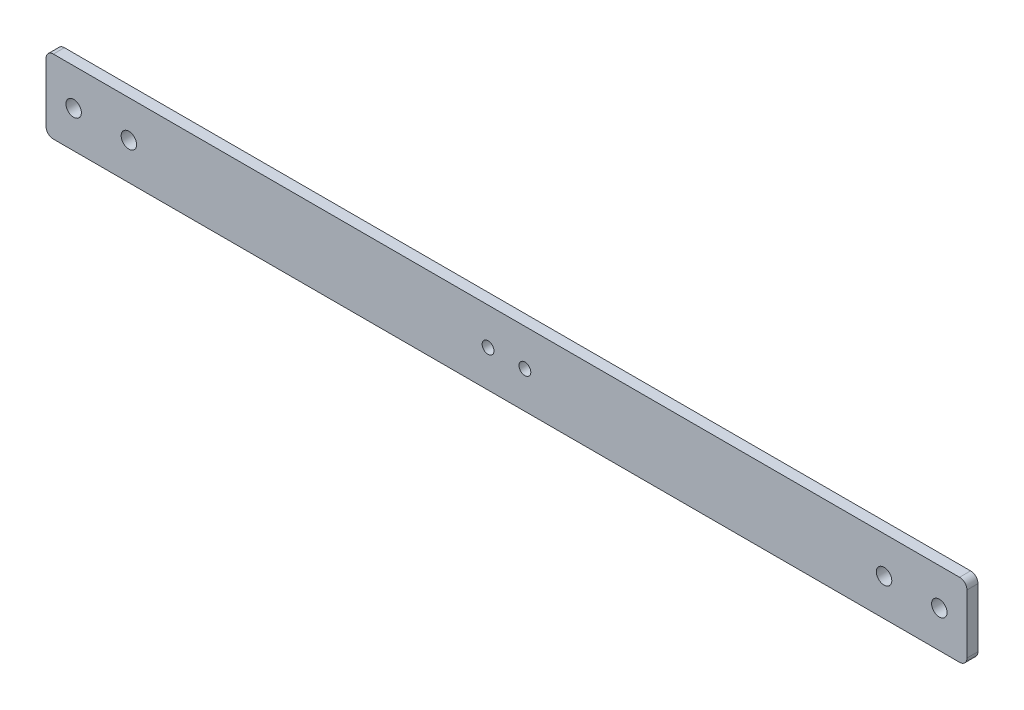
ISO-10303-21;
HEADER;
FILE_DESCRIPTION(('STEP AP214'),'2;1');
FILE_NAME('part.step','',(''),(''),'','','');
FILE_SCHEMA(('AUTOMOTIVE_DESIGN { 1 0 10303 214 1 1 1 1 }'));
ENDSEC;
DATA;
#1=APPLICATION_CONTEXT('core data for automotive mechanical design processes');
#2=APPLICATION_PROTOCOL_DEFINITION('international standard','automotive_design',2000,#1);
#3=PRODUCT_CONTEXT('',#1,'mechanical');
#4=PRODUCT('Part','Part','',(#3));
#5=PRODUCT_RELATED_PRODUCT_CATEGORY('part','',(#4));
#6=PRODUCT_DEFINITION_FORMATION('','',#4);
#7=PRODUCT_DEFINITION_CONTEXT('part definition',#1,'design');
#8=PRODUCT_DEFINITION('design','',#6,#7);
#9=PRODUCT_DEFINITION_SHAPE('','',#8);
#10=(LENGTH_UNIT() NAMED_UNIT(*) SI_UNIT(.MILLI.,.METRE.));
#11=(NAMED_UNIT(*) PLANE_ANGLE_UNIT() SI_UNIT($,.RADIAN.));
#12=(NAMED_UNIT(*) SI_UNIT($,.STERADIAN.) SOLID_ANGLE_UNIT());
#13=UNCERTAINTY_MEASURE_WITH_UNIT(LENGTH_MEASURE(1.E-05),#10,'distance_accuracy_value','');
#14=(GEOMETRIC_REPRESENTATION_CONTEXT(3) GLOBAL_UNCERTAINTY_ASSIGNED_CONTEXT((#13)) GLOBAL_UNIT_ASSIGNED_CONTEXT((#10,
#11,#12)) REPRESENTATION_CONTEXT('',''));
#15=CARTESIAN_POINT('',(0.,0.,0.));
#16=DIRECTION('',(0.,0.,1.));
#17=DIRECTION('',(1.,0.,0.));
#18=AXIS2_PLACEMENT_3D('',#15,#16,#17);
#19=CARTESIAN_POINT('',(125.,-10.,3.));
#20=DIRECTION('',(-1.,0.,0.));
#21=DIRECTION('',(0.,0.,1.));
#22=AXIS2_PLACEMENT_3D('',#19,#20,#21);
#23=PLANE('',#22);
#24=DIRECTION('',(0.,1.,0.));
#25=VECTOR('',#24,1.);
#26=CARTESIAN_POINT('',(125.,-10.,3.));
#27=LINE('',#26,#25);
#28=CARTESIAN_POINT('',(125.,-8.,3.));
#29=VERTEX_POINT('',#28);
#30=CARTESIAN_POINT('',(125.,8.,3.));
#31=VERTEX_POINT('',#30);
#32=EDGE_CURVE('E122',#29,#31,#27,.T.);
#33=ORIENTED_EDGE('',*,*,#32,.F.);
#34=DIRECTION('',(0.,0.,-1.));
#35=VECTOR('',#34,1.);
#36=CARTESIAN_POINT('',(125.,-8.,3.));
#37=LINE('',#36,#35);
#38=CARTESIAN_POINT('',(125.,-8.,0.));
#39=VERTEX_POINT('',#38);
#40=EDGE_CURVE('E107',#29,#39,#37,.T.);
#41=ORIENTED_EDGE('',*,*,#40,.T.);
#42=DIRECTION('',(0.,1.,0.));
#43=VECTOR('',#42,1.);
#44=CARTESIAN_POINT('',(125.,-10.,0.));
#45=LINE('',#44,#43);
#46=CARTESIAN_POINT('',(125.,8.,0.));
#47=VERTEX_POINT('',#46);
#48=EDGE_CURVE('E119',#39,#47,#45,.T.);
#49=ORIENTED_EDGE('',*,*,#48,.T.);
#50=DIRECTION('',(0.,0.,-1.));
#51=VECTOR('',#50,1.);
#52=CARTESIAN_POINT('',(125.,8.,3.));
#53=LINE('',#52,#51);
#54=EDGE_CURVE('E124',#47,#31,#53,.F.);
#55=ORIENTED_EDGE('',*,*,#54,.T.);
#56=EDGE_LOOP('',(#33,#41,#49,#55));
#57=FACE_BOUND('',#56,.T.);
#58=ADVANCED_FACE('F38',(#57),#23,.F.);
#59=CARTESIAN_POINT('',(-125.,10.,3.));
#60=DIRECTION('',(0.,-1.,0.));
#61=DIRECTION('',(0.,0.,-1.));
#62=AXIS2_PLACEMENT_3D('',#59,#60,#61);
#63=PLANE('',#62);
#64=DIRECTION('',(-1.,0.,0.));
#65=VECTOR('',#64,1.);
#66=CARTESIAN_POINT('',(-125.,10.,3.));
#67=LINE('',#66,#65);
#68=CARTESIAN_POINT('',(123.,10.,3.));
#69=VERTEX_POINT('',#68);
#70=CARTESIAN_POINT('',(-123.,10.,3.));
#71=VERTEX_POINT('',#70);
#72=EDGE_CURVE('E177',#69,#71,#67,.T.);
#73=ORIENTED_EDGE('',*,*,#72,.F.);
#74=DIRECTION('',(0.,0.,-1.));
#75=VECTOR('',#74,1.);
#76=CARTESIAN_POINT('',(123.,10.,3.));
#77=LINE('',#76,#75);
#78=CARTESIAN_POINT('',(123.,10.,0.));
#79=VERTEX_POINT('',#78);
#80=EDGE_CURVE('E161',#69,#79,#77,.T.);
#81=ORIENTED_EDGE('',*,*,#80,.T.);
#82=DIRECTION('',(-1.,0.,0.));
#83=VECTOR('',#82,1.);
#84=CARTESIAN_POINT('',(-125.,10.,0.));
#85=LINE('',#84,#83);
#86=CARTESIAN_POINT('',(-123.,10.,0.));
#87=VERTEX_POINT('',#86);
#88=EDGE_CURVE('E128',#79,#87,#85,.T.);
#89=ORIENTED_EDGE('',*,*,#88,.T.);
#90=DIRECTION('',(0.,0.,-1.));
#91=VECTOR('',#90,1.);
#92=CARTESIAN_POINT('',(-123.,10.,3.));
#93=LINE('',#92,#91);
#94=EDGE_CURVE('E159',#87,#71,#93,.F.);
#95=ORIENTED_EDGE('',*,*,#94,.T.);
#96=EDGE_LOOP('',(#73,#81,#89,#95));
#97=FACE_BOUND('',#96,.T.);
#98=ADVANCED_FACE('F247',(#97),#63,.F.);
#99=CARTESIAN_POINT('',(-125.,-10.,3.));
#100=DIRECTION('',(1.,0.,0.));
#101=DIRECTION('',(0.,0.,-1.));
#102=AXIS2_PLACEMENT_3D('',#99,#100,#101);
#103=PLANE('',#102);
#104=DIRECTION('',(0.,-1.,0.));
#105=VECTOR('',#104,1.);
#106=CARTESIAN_POINT('',(-125.,-10.,0.));
#107=LINE('',#106,#105);
#108=CARTESIAN_POINT('',(-125.,8.,0.));
#109=VERTEX_POINT('',#108);
#110=CARTESIAN_POINT('',(-125.,-8.,0.));
#111=VERTEX_POINT('',#110);
#112=EDGE_CURVE('E132',#109,#111,#107,.T.);
#113=ORIENTED_EDGE('',*,*,#112,.T.);
#114=DIRECTION('',(0.,0.,-1.));
#115=VECTOR('',#114,1.);
#116=CARTESIAN_POINT('',(-125.,-8.,3.));
#117=LINE('',#116,#115);
#118=CARTESIAN_POINT('',(-125.,-8.,3.));
#119=VERTEX_POINT('',#118);
#120=EDGE_CURVE('E11',#111,#119,#117,.F.);
#121=ORIENTED_EDGE('',*,*,#120,.T.);
#122=DIRECTION('',(0.,-1.,0.));
#123=VECTOR('',#122,1.);
#124=CARTESIAN_POINT('',(-125.,-10.,3.));
#125=LINE('',#124,#123);
#126=CARTESIAN_POINT('',(-125.,8.,3.));
#127=VERTEX_POINT('',#126);
#128=EDGE_CURVE('E167',#127,#119,#125,.T.);
#129=ORIENTED_EDGE('',*,*,#128,.F.);
#130=DIRECTION('',(0.,0.,-1.));
#131=VECTOR('',#130,1.);
#132=CARTESIAN_POINT('',(-125.,8.,3.));
#133=LINE('',#132,#131);
#134=EDGE_CURVE('E46',#127,#109,#133,.T.);
#135=ORIENTED_EDGE('',*,*,#134,.T.);
#136=EDGE_LOOP('',(#113,#121,#129,#135));
#137=FACE_BOUND('',#136,.T.);
#138=ADVANCED_FACE('F166',(#137),#103,.F.);
#139=CARTESIAN_POINT('',(-125.,-10.,3.));
#140=DIRECTION('',(0.,1.,0.));
#141=DIRECTION('',(0.,0.,1.));
#142=AXIS2_PLACEMENT_3D('',#139,#140,#141);
#143=PLANE('',#142);
#144=DIRECTION('',(1.,0.,0.));
#145=VECTOR('',#144,1.);
#146=CARTESIAN_POINT('',(-125.,-10.,0.));
#147=LINE('',#146,#145);
#148=CARTESIAN_POINT('',(-123.,-10.,0.));
#149=VERTEX_POINT('',#148);
#150=CARTESIAN_POINT('',(123.,-10.,0.));
#151=VERTEX_POINT('',#150);
#152=EDGE_CURVE('E142',#149,#151,#147,.T.);
#153=ORIENTED_EDGE('',*,*,#152,.T.);
#154=DIRECTION('',(0.,0.,-1.));
#155=VECTOR('',#154,1.);
#156=CARTESIAN_POINT('',(123.,-10.,3.));
#157=LINE('',#156,#155);
#158=CARTESIAN_POINT('',(123.,-10.,3.));
#159=VERTEX_POINT('',#158);
#160=EDGE_CURVE('E108',#151,#159,#157,.F.);
#161=ORIENTED_EDGE('',*,*,#160,.T.);
#162=DIRECTION('',(1.,0.,0.));
#163=VECTOR('',#162,1.);
#164=CARTESIAN_POINT('',(-125.,-10.,3.));
#165=LINE('',#164,#163);
#166=CARTESIAN_POINT('',(-123.,-10.,3.));
#167=VERTEX_POINT('',#166);
#168=EDGE_CURVE('E138',#167,#159,#165,.T.);
#169=ORIENTED_EDGE('',*,*,#168,.F.);
#170=DIRECTION('',(0.,0.,-1.));
#171=VECTOR('',#170,1.);
#172=CARTESIAN_POINT('',(-123.,-10.,3.));
#173=LINE('',#172,#171);
#174=EDGE_CURVE('E113',#167,#149,#173,.T.);
#175=ORIENTED_EDGE('',*,*,#174,.T.);
#176=EDGE_LOOP('',(#153,#161,#169,#175));
#177=FACE_BOUND('',#176,.T.);
#178=ADVANCED_FACE('F175',(#177),#143,.F.);
#179=CARTESIAN_POINT('',(0.,0.,3.));
#180=DIRECTION('',(0.,0.,-1.));
#181=DIRECTION('',(-1.,0.,0.));
#182=AXIS2_PLACEMENT_3D('',#179,#180,#181);
#183=PLANE('',#182);
#184=CARTESIAN_POINT('',(-117.5,0.,3.));
#185=DIRECTION('',(0.,0.,1.));
#186=DIRECTION('',(1.,0.,0.));
#187=AXIS2_PLACEMENT_3D('',#184,#185,#186);
#188=CIRCLE('',#187,2.1);
#189=CARTESIAN_POINT('',(-115.4,0.,3.));
#190=VERTEX_POINT('',#189);
#191=EDGE_CURVE('E135',#190,#190,#188,.T.);
#192=ORIENTED_EDGE('',*,*,#191,.F.);
#193=EDGE_LOOP('',(#192));
#194=FACE_BOUND('',#193,.T.);
#195=CARTESIAN_POINT('',(5.,0.,3.));
#196=DIRECTION('',(0.,0.,1.));
#197=DIRECTION('',(-1.,0.,0.));
#198=AXIS2_PLACEMENT_3D('',#195,#196,#197);
#199=CIRCLE('',#198,1.6);
#200=CARTESIAN_POINT('',(3.4,0.,3.));
#201=VERTEX_POINT('',#200);
#202=EDGE_CURVE('E206',#201,#201,#199,.T.);
#203=ORIENTED_EDGE('',*,*,#202,.F.);
#204=EDGE_LOOP('',(#203));
#205=FACE_BOUND('',#204,.T.);
#206=CARTESIAN_POINT('',(-102.5,0.,3.));
#207=DIRECTION('',(0.,0.,1.));
#208=DIRECTION('',(1.,0.,0.));
#209=AXIS2_PLACEMENT_3D('',#206,#207,#208);
#210=CIRCLE('',#209,2.1);
#211=CARTESIAN_POINT('',(-100.4,0.,3.));
#212=VERTEX_POINT('',#211);
#213=EDGE_CURVE('E188',#212,#212,#210,.T.);
#214=ORIENTED_EDGE('',*,*,#213,.F.);
#215=EDGE_LOOP('',(#214));
#216=FACE_BOUND('',#215,.T.);
#217=CARTESIAN_POINT('',(102.5,0.,3.));
#218=DIRECTION('',(0.,0.,1.));
#219=DIRECTION('',(-1.,0.,0.));
#220=AXIS2_PLACEMENT_3D('',#217,#218,#219);
#221=CIRCLE('',#220,2.1);
#222=CARTESIAN_POINT('',(100.4,0.,3.));
#223=VERTEX_POINT('',#222);
#224=EDGE_CURVE('E181',#223,#223,#221,.T.);
#225=ORIENTED_EDGE('',*,*,#224,.F.);
#226=EDGE_LOOP('',(#225));
#227=FACE_BOUND('',#226,.T.);
#228=CARTESIAN_POINT('',(117.5,0.,3.));
#229=DIRECTION('',(0.,0.,1.));
#230=DIRECTION('',(-1.,0.,0.));
#231=AXIS2_PLACEMENT_3D('',#228,#229,#230);
#232=CIRCLE('',#231,2.1);
#233=CARTESIAN_POINT('',(115.4,0.,3.));
#234=VERTEX_POINT('',#233);
#235=EDGE_CURVE('E201',#234,#234,#232,.T.);
#236=ORIENTED_EDGE('',*,*,#235,.F.);
#237=EDGE_LOOP('',(#236));
#238=FACE_BOUND('',#237,.T.);
#239=CARTESIAN_POINT('',(-5.,0.,3.));
#240=DIRECTION('',(0.,0.,1.));
#241=DIRECTION('',(1.,0.,0.));
#242=AXIS2_PLACEMENT_3D('',#239,#240,#241);
#243=CIRCLE('',#242,1.6);
#244=CARTESIAN_POINT('',(-3.4,0.,3.));
#245=VERTEX_POINT('',#244);
#246=EDGE_CURVE('E194',#245,#245,#243,.T.);
#247=ORIENTED_EDGE('',*,*,#246,.F.);
#248=EDGE_LOOP('',(#247));
#249=FACE_BOUND('',#248,.T.);
#250=ORIENTED_EDGE('',*,*,#168,.T.);
#251=CARTESIAN_POINT('',(123.,-8.,3.));
#252=DIRECTION('',(0.,0.,-1.));
#253=DIRECTION('',(-1.,0.,0.));
#254=AXIS2_PLACEMENT_3D('',#251,#252,#253);
#255=CIRCLE('',#254,2.);
#256=EDGE_CURVE('E157',#159,#29,#255,.F.);
#257=ORIENTED_EDGE('',*,*,#256,.T.);
#258=ORIENTED_EDGE('',*,*,#32,.T.);
#259=CARTESIAN_POINT('',(123.,8.,3.));
#260=DIRECTION('',(0.,0.,-1.));
#261=DIRECTION('',(-1.,0.,0.));
#262=AXIS2_PLACEMENT_3D('',#259,#260,#261);
#263=CIRCLE('',#262,2.);
#264=EDGE_CURVE('E155',#31,#69,#263,.F.);
#265=ORIENTED_EDGE('',*,*,#264,.T.);
#266=ORIENTED_EDGE('',*,*,#72,.T.);
#267=CARTESIAN_POINT('',(-123.,8.,3.));
#268=DIRECTION('',(0.,0.,-1.));
#269=DIRECTION('',(-1.,0.,0.));
#270=AXIS2_PLACEMENT_3D('',#267,#268,#269);
#271=CIRCLE('',#270,2.);
#272=EDGE_CURVE('E58',#71,#127,#271,.F.);
#273=ORIENTED_EDGE('',*,*,#272,.T.);
#274=ORIENTED_EDGE('',*,*,#128,.T.);
#275=CARTESIAN_POINT('',(-123.,-8.,3.));
#276=DIRECTION('',(0.,0.,-1.));
#277=DIRECTION('',(-1.,0.,0.));
#278=AXIS2_PLACEMENT_3D('',#275,#276,#277);
#279=CIRCLE('',#278,2.);
#280=EDGE_CURVE('E153',#119,#167,#279,.F.);
#281=ORIENTED_EDGE('',*,*,#280,.T.);
#282=EDGE_LOOP('',(#250,#257,#258,#265,#266,#273,#274,#281));
#283=FACE_BOUND('',#282,.T.);
#284=ADVANCED_FACE('F216',(#194,#205,#216,#227,#238,#249,#283),#183,.F.);
#285=CARTESIAN_POINT('',(0.,0.,0.));
#286=DIRECTION('',(0.,0.,-1.));
#287=DIRECTION('',(-1.,0.,0.));
#288=AXIS2_PLACEMENT_3D('',#285,#286,#287);
#289=PLANE('',#288);
#290=CARTESIAN_POINT('',(-117.5,0.,0.));
#291=DIRECTION('',(0.,0.,1.));
#292=DIRECTION('',(1.,0.,0.));
#293=AXIS2_PLACEMENT_3D('',#290,#291,#292);
#294=CIRCLE('',#293,2.1);
#295=CARTESIAN_POINT('',(-115.4,0.,0.));
#296=VERTEX_POINT('',#295);
#297=EDGE_CURVE('E129',#296,#296,#294,.T.);
#298=ORIENTED_EDGE('',*,*,#297,.T.);
#299=EDGE_LOOP('',(#298));
#300=FACE_BOUND('',#299,.T.);
#301=CARTESIAN_POINT('',(5.,0.,0.));
#302=DIRECTION('',(0.,0.,1.));
#303=DIRECTION('',(-1.,0.,0.));
#304=AXIS2_PLACEMENT_3D('',#301,#302,#303);
#305=CIRCLE('',#304,1.6);
#306=CARTESIAN_POINT('',(3.4,0.,0.));
#307=VERTEX_POINT('',#306);
#308=EDGE_CURVE('E198',#307,#307,#305,.T.);
#309=ORIENTED_EDGE('',*,*,#308,.T.);
#310=EDGE_LOOP('',(#309));
#311=FACE_BOUND('',#310,.T.);
#312=CARTESIAN_POINT('',(-102.5,0.,0.));
#313=DIRECTION('',(0.,0.,1.));
#314=DIRECTION('',(1.,0.,0.));
#315=AXIS2_PLACEMENT_3D('',#312,#313,#314);
#316=CIRCLE('',#315,2.1);
#317=CARTESIAN_POINT('',(-100.4,0.,0.));
#318=VERTEX_POINT('',#317);
#319=EDGE_CURVE('E191',#318,#318,#316,.T.);
#320=ORIENTED_EDGE('',*,*,#319,.T.);
#321=EDGE_LOOP('',(#320));
#322=FACE_BOUND('',#321,.T.);
#323=CARTESIAN_POINT('',(102.5,0.,0.));
#324=DIRECTION('',(0.,0.,1.));
#325=DIRECTION('',(-1.,0.,0.));
#326=AXIS2_PLACEMENT_3D('',#323,#324,#325);
#327=CIRCLE('',#326,2.1);
#328=CARTESIAN_POINT('',(100.4,0.,0.));
#329=VERTEX_POINT('',#328);
#330=EDGE_CURVE('E184',#329,#329,#327,.T.);
#331=ORIENTED_EDGE('',*,*,#330,.T.);
#332=EDGE_LOOP('',(#331));
#333=FACE_BOUND('',#332,.T.);
#334=CARTESIAN_POINT('',(117.5,0.,0.));
#335=DIRECTION('',(0.,0.,1.));
#336=DIRECTION('',(-1.,0.,0.));
#337=AXIS2_PLACEMENT_3D('',#334,#335,#336);
#338=CIRCLE('',#337,2.1);
#339=CARTESIAN_POINT('',(115.4,0.,0.));
#340=VERTEX_POINT('',#339);
#341=EDGE_CURVE('E185',#340,#340,#338,.T.);
#342=ORIENTED_EDGE('',*,*,#341,.T.);
#343=EDGE_LOOP('',(#342));
#344=FACE_BOUND('',#343,.T.);
#345=CARTESIAN_POINT('',(-5.,0.,0.));
#346=DIRECTION('',(0.,0.,1.));
#347=DIRECTION('',(1.,0.,0.));
#348=AXIS2_PLACEMENT_3D('',#345,#346,#347);
#349=CIRCLE('',#348,1.6);
#350=CARTESIAN_POINT('',(-3.4,0.,0.));
#351=VERTEX_POINT('',#350);
#352=EDGE_CURVE('E197',#351,#351,#349,.T.);
#353=ORIENTED_EDGE('',*,*,#352,.T.);
#354=EDGE_LOOP('',(#353));
#355=FACE_BOUND('',#354,.T.);
#356=ORIENTED_EDGE('',*,*,#48,.F.);
#357=CARTESIAN_POINT('',(123.,-8.,0.));
#358=DIRECTION('',(0.,0.,-1.));
#359=DIRECTION('',(-1.,0.,0.));
#360=AXIS2_PLACEMENT_3D('',#357,#358,#359);
#361=CIRCLE('',#360,2.);
#362=EDGE_CURVE('E103',#39,#151,#361,.T.);
#363=ORIENTED_EDGE('',*,*,#362,.T.);
#364=ORIENTED_EDGE('',*,*,#152,.F.);
#365=CARTESIAN_POINT('',(-123.,-8.,0.));
#366=DIRECTION('',(0.,0.,-1.));
#367=DIRECTION('',(-1.,0.,0.));
#368=AXIS2_PLACEMENT_3D('',#365,#366,#367);
#369=CIRCLE('',#368,2.);
#370=EDGE_CURVE('E146',#149,#111,#369,.T.);
#371=ORIENTED_EDGE('',*,*,#370,.T.);
#372=ORIENTED_EDGE('',*,*,#112,.F.);
#373=CARTESIAN_POINT('',(-123.,8.,0.));
#374=DIRECTION('',(0.,0.,-1.));
#375=DIRECTION('',(-1.,0.,0.));
#376=AXIS2_PLACEMENT_3D('',#373,#374,#375);
#377=CIRCLE('',#376,2.);
#378=EDGE_CURVE('E123',#109,#87,#377,.T.);
#379=ORIENTED_EDGE('',*,*,#378,.T.);
#380=ORIENTED_EDGE('',*,*,#88,.F.);
#381=CARTESIAN_POINT('',(123.,8.,0.));
#382=DIRECTION('',(0.,0.,-1.));
#383=DIRECTION('',(-1.,0.,0.));
#384=AXIS2_PLACEMENT_3D('',#381,#382,#383);
#385=CIRCLE('',#384,2.);
#386=EDGE_CURVE('E114',#79,#47,#385,.T.);
#387=ORIENTED_EDGE('',*,*,#386,.T.);
#388=EDGE_LOOP('',(#356,#363,#364,#371,#372,#379,#380,#387));
#389=FACE_BOUND('',#388,.T.);
#390=ADVANCED_FACE('F126',(#300,#311,#322,#333,#344,#355,#389),#289,.T.);
#391=CARTESIAN_POINT('',(-5.,0.,0.));
#392=DIRECTION('',(0.,0.,1.));
#393=DIRECTION('',(1.,0.,0.));
#394=AXIS2_PLACEMENT_3D('',#391,#392,#393);
#395=CYLINDRICAL_SURFACE('',#394,1.6);
#396=ORIENTED_EDGE('',*,*,#352,.F.);
#397=EDGE_LOOP('',(#396));
#398=FACE_BOUND('',#397,.T.);
#399=ORIENTED_EDGE('',*,*,#246,.T.);
#400=EDGE_LOOP('',(#399));
#401=FACE_BOUND('',#400,.T.);
#402=ADVANCED_FACE('F230',(#398,#401),#395,.F.);
#403=CARTESIAN_POINT('',(117.5,0.,0.));
#404=DIRECTION('',(0.,0.,1.));
#405=DIRECTION('',(1.,0.,0.));
#406=AXIS2_PLACEMENT_3D('',#403,#404,#405);
#407=CYLINDRICAL_SURFACE('',#406,2.1);
#408=ORIENTED_EDGE('',*,*,#341,.F.);
#409=EDGE_LOOP('',(#408));
#410=FACE_BOUND('',#409,.T.);
#411=ORIENTED_EDGE('',*,*,#235,.T.);
#412=EDGE_LOOP('',(#411));
#413=FACE_BOUND('',#412,.T.);
#414=ADVANCED_FACE('F232',(#410,#413),#407,.F.);
#415=CARTESIAN_POINT('',(102.5,0.,0.));
#416=DIRECTION('',(0.,0.,1.));
#417=DIRECTION('',(1.,0.,0.));
#418=AXIS2_PLACEMENT_3D('',#415,#416,#417);
#419=CYLINDRICAL_SURFACE('',#418,2.1);
#420=ORIENTED_EDGE('',*,*,#330,.F.);
#421=EDGE_LOOP('',(#420));
#422=FACE_BOUND('',#421,.T.);
#423=ORIENTED_EDGE('',*,*,#224,.T.);
#424=EDGE_LOOP('',(#423));
#425=FACE_BOUND('',#424,.T.);
#426=ADVANCED_FACE('F239',(#422,#425),#419,.F.);
#427=CARTESIAN_POINT('',(-102.5,0.,0.));
#428=DIRECTION('',(0.,0.,1.));
#429=DIRECTION('',(1.,0.,0.));
#430=AXIS2_PLACEMENT_3D('',#427,#428,#429);
#431=CYLINDRICAL_SURFACE('',#430,2.1);
#432=ORIENTED_EDGE('',*,*,#319,.F.);
#433=EDGE_LOOP('',(#432));
#434=FACE_BOUND('',#433,.T.);
#435=ORIENTED_EDGE('',*,*,#213,.T.);
#436=EDGE_LOOP('',(#435));
#437=FACE_BOUND('',#436,.T.);
#438=ADVANCED_FACE('F344',(#434,#437),#431,.F.);
#439=CARTESIAN_POINT('',(5.,0.,0.));
#440=DIRECTION('',(0.,0.,1.));
#441=DIRECTION('',(1.,0.,0.));
#442=AXIS2_PLACEMENT_3D('',#439,#440,#441);
#443=CYLINDRICAL_SURFACE('',#442,1.6);
#444=ORIENTED_EDGE('',*,*,#308,.F.);
#445=EDGE_LOOP('',(#444));
#446=FACE_BOUND('',#445,.T.);
#447=ORIENTED_EDGE('',*,*,#202,.T.);
#448=EDGE_LOOP('',(#447));
#449=FACE_BOUND('',#448,.T.);
#450=ADVANCED_FACE('F334',(#446,#449),#443,.F.);
#451=CARTESIAN_POINT('',(-117.5,0.,0.));
#452=DIRECTION('',(0.,0.,1.));
#453=DIRECTION('',(1.,0.,0.));
#454=AXIS2_PLACEMENT_3D('',#451,#452,#453);
#455=CYLINDRICAL_SURFACE('',#454,2.1);
#456=ORIENTED_EDGE('',*,*,#297,.F.);
#457=EDGE_LOOP('',(#456));
#458=FACE_BOUND('',#457,.T.);
#459=ORIENTED_EDGE('',*,*,#191,.T.);
#460=EDGE_LOOP('',(#459));
#461=FACE_BOUND('',#460,.T.);
#462=ADVANCED_FACE('F214',(#458,#461),#455,.F.);
#463=CARTESIAN_POINT('',(123.,-8.,3.));
#464=DIRECTION('',(0.,0.,-1.));
#465=DIRECTION('',(-1.,0.,0.));
#466=AXIS2_PLACEMENT_3D('',#463,#464,#465);
#467=CYLINDRICAL_SURFACE('',#466,2.);
#468=ORIENTED_EDGE('',*,*,#256,.F.);
#469=ORIENTED_EDGE('',*,*,#160,.F.);
#470=ORIENTED_EDGE('',*,*,#362,.F.);
#471=ORIENTED_EDGE('',*,*,#40,.F.);
#472=EDGE_LOOP('',(#468,#469,#470,#471));
#473=FACE_BOUND('',#472,.T.);
#474=ADVANCED_FACE('F106',(#473),#467,.T.);
#475=CARTESIAN_POINT('',(123.,8.,3.));
#476=DIRECTION('',(0.,0.,-1.));
#477=DIRECTION('',(-1.,0.,0.));
#478=AXIS2_PLACEMENT_3D('',#475,#476,#477);
#479=CYLINDRICAL_SURFACE('',#478,2.);
#480=ORIENTED_EDGE('',*,*,#264,.F.);
#481=ORIENTED_EDGE('',*,*,#54,.F.);
#482=ORIENTED_EDGE('',*,*,#386,.F.);
#483=ORIENTED_EDGE('',*,*,#80,.F.);
#484=EDGE_LOOP('',(#480,#481,#482,#483));
#485=FACE_BOUND('',#484,.T.);
#486=ADVANCED_FACE('F258',(#485),#479,.T.);
#487=CARTESIAN_POINT('',(-123.,-8.,3.));
#488=DIRECTION('',(0.,0.,-1.));
#489=DIRECTION('',(-1.,0.,0.));
#490=AXIS2_PLACEMENT_3D('',#487,#488,#489);
#491=CYLINDRICAL_SURFACE('',#490,2.);
#492=ORIENTED_EDGE('',*,*,#280,.F.);
#493=ORIENTED_EDGE('',*,*,#120,.F.);
#494=ORIENTED_EDGE('',*,*,#370,.F.);
#495=ORIENTED_EDGE('',*,*,#174,.F.);
#496=EDGE_LOOP('',(#492,#493,#494,#495));
#497=FACE_BOUND('',#496,.T.);
#498=ADVANCED_FACE('F172',(#497),#491,.T.);
#499=CARTESIAN_POINT('',(-123.,8.,3.));
#500=DIRECTION('',(0.,0.,-1.));
#501=DIRECTION('',(-1.,0.,0.));
#502=AXIS2_PLACEMENT_3D('',#499,#500,#501);
#503=CYLINDRICAL_SURFACE('',#502,2.);
#504=ORIENTED_EDGE('',*,*,#272,.F.);
#505=ORIENTED_EDGE('',*,*,#94,.F.);
#506=ORIENTED_EDGE('',*,*,#378,.F.);
#507=ORIENTED_EDGE('',*,*,#134,.F.);
#508=EDGE_LOOP('',(#504,#505,#506,#507));
#509=FACE_BOUND('',#508,.T.);
#510=ADVANCED_FACE('F40',(#509),#503,.T.);
#511=CLOSED_SHELL('',(#58,#98,#138,#178,#284,#390,#402,#414,#426,#438,#450,#462,#474,#486,#498,#510));
#512=MANIFOLD_SOLID_BREP('B2',#511);
#513=ADVANCED_BREP_SHAPE_REPRESENTATION('',(#18,#512),#14);
#514=SHAPE_DEFINITION_REPRESENTATION(#9,#513);
ENDSEC;
END-ISO-10303-21;
